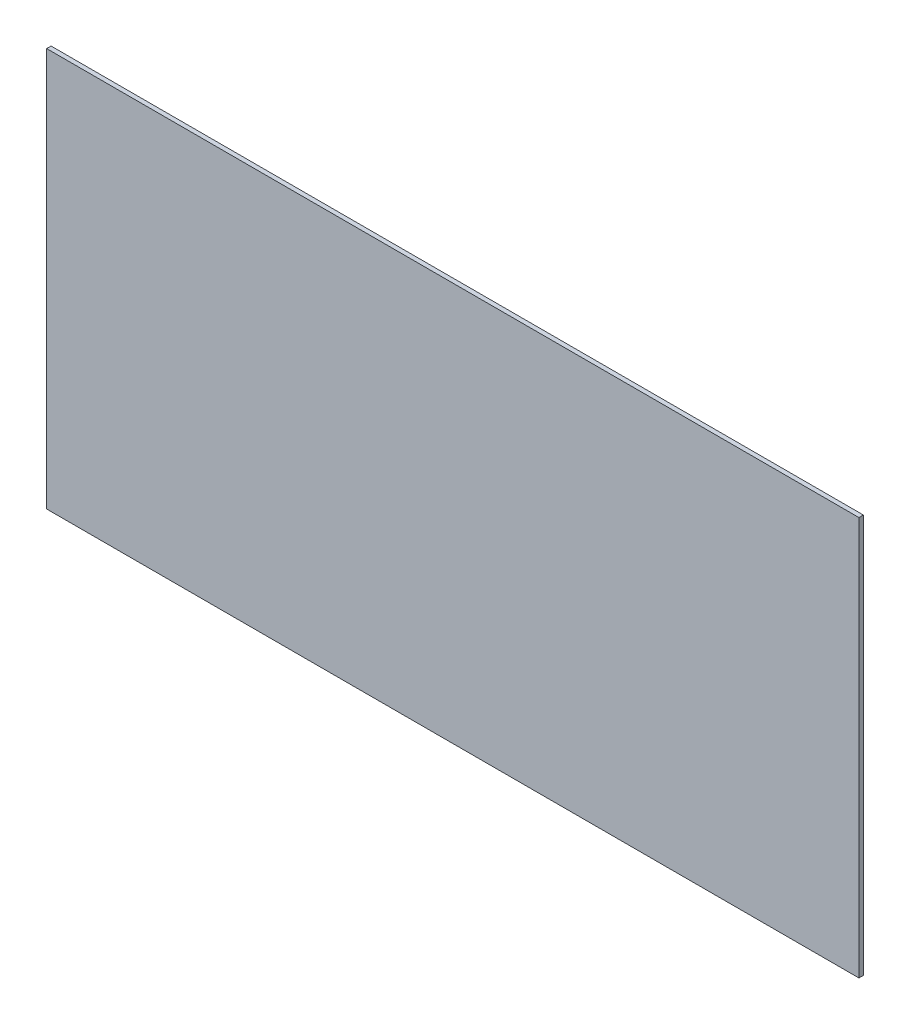
ISO-10303-21;
HEADER;
FILE_DESCRIPTION(('STEP AP214'),'2;1');
FILE_NAME('part.step','',(''),(''),'','','');
FILE_SCHEMA(('AUTOMOTIVE_DESIGN { 1 0 10303 214 1 1 1 1 }'));
ENDSEC;
DATA;
#1=APPLICATION_CONTEXT('core data for automotive mechanical design processes');
#2=APPLICATION_PROTOCOL_DEFINITION('international standard','automotive_design',2000,#1);
#3=PRODUCT_CONTEXT('',#1,'mechanical');
#4=PRODUCT('Part','Part','',(#3));
#5=PRODUCT_RELATED_PRODUCT_CATEGORY('part','',(#4));
#6=PRODUCT_DEFINITION_FORMATION('','',#4);
#7=PRODUCT_DEFINITION_CONTEXT('part definition',#1,'design');
#8=PRODUCT_DEFINITION('design','',#6,#7);
#9=PRODUCT_DEFINITION_SHAPE('','',#8);
#10=(LENGTH_UNIT() NAMED_UNIT(*) SI_UNIT(.MILLI.,.METRE.));
#11=(NAMED_UNIT(*) PLANE_ANGLE_UNIT() SI_UNIT($,.RADIAN.));
#12=(NAMED_UNIT(*) SI_UNIT($,.STERADIAN.) SOLID_ANGLE_UNIT());
#13=UNCERTAINTY_MEASURE_WITH_UNIT(LENGTH_MEASURE(1.E-05),#10,'distance_accuracy_value','');
#14=(GEOMETRIC_REPRESENTATION_CONTEXT(3) GLOBAL_UNCERTAINTY_ASSIGNED_CONTEXT((#13)) GLOBAL_UNIT_ASSIGNED_CONTEXT((#10,
#11,#12)) REPRESENTATION_CONTEXT('',''));
#15=CARTESIAN_POINT('',(0.,0.,0.));
#16=DIRECTION('',(0.,0.,1.));
#17=DIRECTION('',(1.,0.,0.));
#18=AXIS2_PLACEMENT_3D('',#15,#16,#17);
#19=CARTESIAN_POINT('',(275.,-135.,3.));
#20=DIRECTION('',(-1.,0.,0.));
#21=DIRECTION('',(0.,0.,1.));
#22=AXIS2_PLACEMENT_3D('',#19,#20,#21);
#23=PLANE('',#22);
#24=DIRECTION('',(0.,1.,0.));
#25=VECTOR('',#24,1.);
#26=CARTESIAN_POINT('',(275.,-135.,0.));
#27=LINE('',#26,#25);
#28=CARTESIAN_POINT('',(275.,-135.,0.));
#29=VERTEX_POINT('',#28);
#30=CARTESIAN_POINT('',(275.,135.,0.));
#31=VERTEX_POINT('',#30);
#32=EDGE_CURVE('E96',#29,#31,#27,.T.);
#33=ORIENTED_EDGE('',*,*,#32,.T.);
#34=DIRECTION('',(0.,0.,-1.));
#35=VECTOR('',#34,1.);
#36=CARTESIAN_POINT('',(275.,135.,3.));
#37=LINE('',#36,#35);
#38=CARTESIAN_POINT('',(275.,135.,3.));
#39=VERTEX_POINT('',#38);
#40=EDGE_CURVE('E11',#39,#31,#37,.T.);
#41=ORIENTED_EDGE('',*,*,#40,.F.);
#42=DIRECTION('',(0.,1.,0.));
#43=VECTOR('',#42,1.);
#44=CARTESIAN_POINT('',(275.,-135.,3.));
#45=LINE('',#44,#43);
#46=CARTESIAN_POINT('',(275.,-135.,3.));
#47=VERTEX_POINT('',#46);
#48=EDGE_CURVE('E84',#47,#39,#45,.T.);
#49=ORIENTED_EDGE('',*,*,#48,.F.);
#50=DIRECTION('',(0.,0.,-1.));
#51=VECTOR('',#50,1.);
#52=CARTESIAN_POINT('',(275.,-135.,3.));
#53=LINE('',#52,#51);
#54=EDGE_CURVE('E92',#47,#29,#53,.T.);
#55=ORIENTED_EDGE('',*,*,#54,.T.);
#56=EDGE_LOOP('',(#33,#41,#49,#55));
#57=FACE_BOUND('',#56,.T.);
#58=ADVANCED_FACE('F33',(#57),#23,.F.);
#59=CARTESIAN_POINT('',(-275.,135.,3.));
#60=DIRECTION('',(0.,-1.,0.));
#61=DIRECTION('',(0.,0.,-1.));
#62=AXIS2_PLACEMENT_3D('',#59,#60,#61);
#63=PLANE('',#62);
#64=DIRECTION('',(-1.,0.,0.));
#65=VECTOR('',#64,1.);
#66=CARTESIAN_POINT('',(-275.,135.,0.));
#67=LINE('',#66,#65);
#68=CARTESIAN_POINT('',(-275.,135.,0.));
#69=VERTEX_POINT('',#68);
#70=EDGE_CURVE('E88',#31,#69,#67,.T.);
#71=ORIENTED_EDGE('',*,*,#70,.T.);
#72=DIRECTION('',(0.,0.,-1.));
#73=VECTOR('',#72,1.);
#74=CARTESIAN_POINT('',(-275.,135.,3.));
#75=LINE('',#74,#73);
#76=CARTESIAN_POINT('',(-275.,135.,3.));
#77=VERTEX_POINT('',#76);
#78=EDGE_CURVE('E41',#77,#69,#75,.T.);
#79=ORIENTED_EDGE('',*,*,#78,.F.);
#80=DIRECTION('',(-1.,0.,0.));
#81=VECTOR('',#80,1.);
#82=CARTESIAN_POINT('',(-275.,135.,3.));
#83=LINE('',#82,#81);
#84=EDGE_CURVE('E79',#39,#77,#83,.T.);
#85=ORIENTED_EDGE('',*,*,#84,.F.);
#86=ORIENTED_EDGE('',*,*,#40,.T.);
#87=EDGE_LOOP('',(#71,#79,#85,#86));
#88=FACE_BOUND('',#87,.T.);
#89=ADVANCED_FACE('F87',(#88),#63,.F.);
#90=CARTESIAN_POINT('',(-275.,-135.,3.));
#91=DIRECTION('',(1.,0.,0.));
#92=DIRECTION('',(0.,0.,-1.));
#93=AXIS2_PLACEMENT_3D('',#90,#91,#92);
#94=PLANE('',#93);
#95=DIRECTION('',(0.,-1.,0.));
#96=VECTOR('',#95,1.);
#97=CARTESIAN_POINT('',(-275.,-135.,0.));
#98=LINE('',#97,#96);
#99=CARTESIAN_POINT('',(-275.,-135.,0.));
#100=VERTEX_POINT('',#99);
#101=EDGE_CURVE('E66',#69,#100,#98,.T.);
#102=ORIENTED_EDGE('',*,*,#101,.T.);
#103=DIRECTION('',(0.,0.,-1.));
#104=VECTOR('',#103,1.);
#105=CARTESIAN_POINT('',(-275.,-135.,3.));
#106=LINE('',#105,#104);
#107=CARTESIAN_POINT('',(-275.,-135.,3.));
#108=VERTEX_POINT('',#107);
#109=EDGE_CURVE('E89',#108,#100,#106,.T.);
#110=ORIENTED_EDGE('',*,*,#109,.F.);
#111=DIRECTION('',(0.,-1.,0.));
#112=VECTOR('',#111,1.);
#113=CARTESIAN_POINT('',(-275.,-135.,3.));
#114=LINE('',#113,#112);
#115=EDGE_CURVE('E82',#77,#108,#114,.T.);
#116=ORIENTED_EDGE('',*,*,#115,.F.);
#117=ORIENTED_EDGE('',*,*,#78,.T.);
#118=EDGE_LOOP('',(#102,#110,#116,#117));
#119=FACE_BOUND('',#118,.T.);
#120=ADVANCED_FACE('F90',(#119),#94,.F.);
#121=CARTESIAN_POINT('',(-275.,-135.,3.));
#122=DIRECTION('',(0.,1.,0.));
#123=DIRECTION('',(0.,0.,1.));
#124=AXIS2_PLACEMENT_3D('',#121,#122,#123);
#125=PLANE('',#124);
#126=DIRECTION('',(1.,0.,0.));
#127=VECTOR('',#126,1.);
#128=CARTESIAN_POINT('',(-275.,-135.,0.));
#129=LINE('',#128,#127);
#130=EDGE_CURVE('E72',#100,#29,#129,.T.);
#131=ORIENTED_EDGE('',*,*,#130,.T.);
#132=ORIENTED_EDGE('',*,*,#54,.F.);
#133=DIRECTION('',(1.,0.,0.));
#134=VECTOR('',#133,1.);
#135=CARTESIAN_POINT('',(-275.,-135.,3.));
#136=LINE('',#135,#134);
#137=EDGE_CURVE('E49',#108,#47,#136,.T.);
#138=ORIENTED_EDGE('',*,*,#137,.F.);
#139=ORIENTED_EDGE('',*,*,#109,.T.);
#140=EDGE_LOOP('',(#131,#132,#138,#139));
#141=FACE_BOUND('',#140,.T.);
#142=ADVANCED_FACE('F103',(#141),#125,.F.);
#143=CARTESIAN_POINT('',(0.,0.,3.));
#144=DIRECTION('',(0.,0.,-1.));
#145=DIRECTION('',(-1.,0.,0.));
#146=AXIS2_PLACEMENT_3D('',#143,#144,#145);
#147=PLANE('',#146);
#148=ORIENTED_EDGE('',*,*,#48,.T.);
#149=ORIENTED_EDGE('',*,*,#84,.T.);
#150=ORIENTED_EDGE('',*,*,#115,.T.);
#151=ORIENTED_EDGE('',*,*,#137,.T.);
#152=EDGE_LOOP('',(#148,#149,#150,#151));
#153=FACE_BOUND('',#152,.T.);
#154=ADVANCED_FACE('F80',(#153),#147,.F.);
#155=CARTESIAN_POINT('',(0.,0.,0.));
#156=DIRECTION('',(0.,0.,-1.));
#157=DIRECTION('',(-1.,0.,0.));
#158=AXIS2_PLACEMENT_3D('',#155,#156,#157);
#159=PLANE('',#158);
#160=ORIENTED_EDGE('',*,*,#32,.F.);
#161=ORIENTED_EDGE('',*,*,#130,.F.);
#162=ORIENTED_EDGE('',*,*,#101,.F.);
#163=ORIENTED_EDGE('',*,*,#70,.F.);
#164=EDGE_LOOP('',(#160,#161,#162,#163));
#165=FACE_BOUND('',#164,.T.);
#166=ADVANCED_FACE('F106',(#165),#159,.T.);
#167=CLOSED_SHELL('',(#58,#89,#120,#142,#154,#166));
#168=MANIFOLD_SOLID_BREP('B2',#167);
#169=ADVANCED_BREP_SHAPE_REPRESENTATION('',(#18,#168),#14);
#170=SHAPE_DEFINITION_REPRESENTATION(#9,#169);
ENDSEC;
END-ISO-10303-21;
